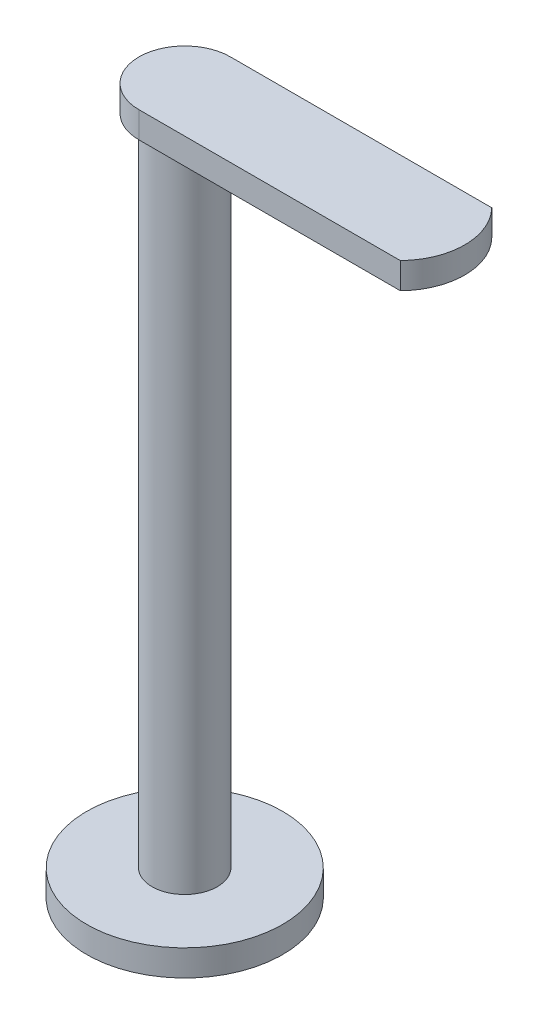
ISO-10303-21;
HEADER;
FILE_DESCRIPTION(('STEP AP214'),'2;1');
FILE_NAME('part.step','',(''),(''),'','','');
FILE_SCHEMA(('AUTOMOTIVE_DESIGN { 1 0 10303 214 1 1 1 1 }'));
ENDSEC;
DATA;
#1=APPLICATION_CONTEXT('core data for automotive mechanical design processes');
#2=APPLICATION_PROTOCOL_DEFINITION('international standard','automotive_design',2000,#1);
#3=PRODUCT_CONTEXT('',#1,'mechanical');
#4=PRODUCT('Part','Part','',(#3));
#5=PRODUCT_RELATED_PRODUCT_CATEGORY('part','',(#4));
#6=PRODUCT_DEFINITION_FORMATION('','',#4);
#7=PRODUCT_DEFINITION_CONTEXT('part definition',#1,'design');
#8=PRODUCT_DEFINITION('design','',#6,#7);
#9=PRODUCT_DEFINITION_SHAPE('','',#8);
#10=(LENGTH_UNIT() NAMED_UNIT(*) SI_UNIT(.MILLI.,.METRE.));
#11=(NAMED_UNIT(*) PLANE_ANGLE_UNIT() SI_UNIT($,.RADIAN.));
#12=(NAMED_UNIT(*) SI_UNIT($,.STERADIAN.) SOLID_ANGLE_UNIT());
#13=UNCERTAINTY_MEASURE_WITH_UNIT(LENGTH_MEASURE(1.E-05),#10,'distance_accuracy_value','');
#14=(GEOMETRIC_REPRESENTATION_CONTEXT(3) GLOBAL_UNCERTAINTY_ASSIGNED_CONTEXT((#13)) GLOBAL_UNIT_ASSIGNED_CONTEXT((#10,
#11,#12)) REPRESENTATION_CONTEXT('',''));
#15=CARTESIAN_POINT('',(0.,0.,0.));
#16=DIRECTION('',(0.,0.,1.));
#17=DIRECTION('',(1.,0.,0.));
#18=AXIS2_PLACEMENT_3D('',#15,#16,#17);
#19=CARTESIAN_POINT('',(0.,127.,0.));
#20=DIRECTION('',(0.,-1.,0.));
#21=DIRECTION('',(0.,0.,-1.));
#22=AXIS2_PLACEMENT_3D('',#19,#20,#21);
#23=CYLINDRICAL_SURFACE('',#22,6.35);
#24=CARTESIAN_POINT('',(0.,127.,0.));
#25=DIRECTION('',(0.,1.,0.));
#26=DIRECTION('',(0.,0.,1.));
#27=AXIS2_PLACEMENT_3D('',#24,#25,#26);
#28=CIRCLE('',#27,6.35);
#29=CARTESIAN_POINT('',(0.,127.,6.35));
#30=VERTEX_POINT('',#29);
#31=EDGE_CURVE('E11',#30,#30,#28,.T.);
#32=ORIENTED_EDGE('',*,*,#31,.F.);
#33=EDGE_LOOP('',(#32));
#34=FACE_BOUND('',#33,.T.);
#35=CARTESIAN_POINT('',(0.,0.,0.));
#36=DIRECTION('',(0.,-1.,0.));
#37=DIRECTION('',(0.,0.,-1.));
#38=AXIS2_PLACEMENT_3D('',#35,#36,#37);
#39=CIRCLE('',#38,6.35);
#40=CARTESIAN_POINT('',(0.,0.,-6.35));
#41=VERTEX_POINT('',#40);
#42=EDGE_CURVE('E98',#41,#41,#39,.T.);
#43=ORIENTED_EDGE('',*,*,#42,.F.);
#44=EDGE_LOOP('',(#43));
#45=FACE_BOUND('',#44,.T.);
#46=ADVANCED_FACE('F33',(#34,#45),#23,.T.);
#47=CARTESIAN_POINT('',(0.,132.08,0.));
#48=DIRECTION('',(0.,-1.,0.));
#49=DIRECTION('',(0.,0.,-1.));
#50=AXIS2_PLACEMENT_3D('',#47,#48,#49);
#51=CYLINDRICAL_SURFACE('',#50,8.89);
#52=CARTESIAN_POINT('',(0.,132.08,0.));
#53=DIRECTION('',(0.,1.,0.));
#54=DIRECTION('',(0.,0.,1.));
#55=AXIS2_PLACEMENT_3D('',#52,#53,#54);
#56=CIRCLE('',#55,8.89);
#57=CARTESIAN_POINT('',(0.,132.08,-8.89));
#58=VERTEX_POINT('',#57);
#59=CARTESIAN_POINT('',(0.,132.08,8.89));
#60=VERTEX_POINT('',#59);
#61=EDGE_CURVE('E40',#58,#60,#56,.T.);
#62=ORIENTED_EDGE('',*,*,#61,.F.);
#63=DIRECTION('',(0.,1.,0.));
#64=VECTOR('',#63,1.);
#65=CARTESIAN_POINT('',(0.,127.,-8.89));
#66=LINE('',#65,#64);
#67=CARTESIAN_POINT('',(0.,127.,-8.89));
#68=VERTEX_POINT('',#67);
#69=EDGE_CURVE('E105',#68,#58,#66,.T.);
#70=ORIENTED_EDGE('',*,*,#69,.F.);
#71=CARTESIAN_POINT('',(0.,127.,0.));
#72=DIRECTION('',(0.,1.,0.));
#73=DIRECTION('',(0.,0.,1.));
#74=AXIS2_PLACEMENT_3D('',#71,#72,#73);
#75=CIRCLE('',#74,8.89);
#76=CARTESIAN_POINT('',(0.,127.,8.89));
#77=VERTEX_POINT('',#76);
#78=EDGE_CURVE('E107',#68,#77,#75,.T.);
#79=ORIENTED_EDGE('',*,*,#78,.T.);
#80=DIRECTION('',(0.,1.,0.));
#81=VECTOR('',#80,1.);
#82=CARTESIAN_POINT('',(0.,127.,8.89));
#83=LINE('',#82,#81);
#84=EDGE_CURVE('E78',#77,#60,#83,.T.);
#85=ORIENTED_EDGE('',*,*,#84,.T.);
#86=EDGE_LOOP('',(#62,#70,#79,#85));
#87=FACE_BOUND('',#86,.T.);
#88=ADVANCED_FACE('F112',(#87),#51,.T.);
#89=CARTESIAN_POINT('',(0.,132.08,0.));
#90=DIRECTION('',(0.,1.,0.));
#91=DIRECTION('',(0.,0.,1.));
#92=AXIS2_PLACEMENT_3D('',#89,#90,#91);
#93=PLANE('',#92);
#94=ORIENTED_EDGE('',*,*,#61,.T.);
#95=DIRECTION('',(1.,0.,0.));
#96=VECTOR('',#95,1.);
#97=CARTESIAN_POINT('',(0.,132.08,8.89));
#98=LINE('',#97,#96);
#99=CARTESIAN_POINT('',(50.8,132.08,8.89));
#100=VERTEX_POINT('',#99);
#101=EDGE_CURVE('E102',#60,#100,#98,.T.);
#102=ORIENTED_EDGE('',*,*,#101,.T.);
#103=CARTESIAN_POINT('',(41.7303858957506,132.08,0.));
#104=DIRECTION('',(0.,1.,0.));
#105=DIRECTION('',(0.,0.,-1.));
#106=AXIS2_PLACEMENT_3D('',#103,#104,#105);
#107=CIRCLE('',#106,12.7);
#108=CARTESIAN_POINT('',(50.8,132.08,-8.89));
#109=VERTEX_POINT('',#108);
#110=EDGE_CURVE('E85',#100,#109,#107,.T.);
#111=ORIENTED_EDGE('',*,*,#110,.T.);
#112=DIRECTION('',(-1.,0.,0.));
#113=VECTOR('',#112,1.);
#114=CARTESIAN_POINT('',(0.,132.08,-8.89));
#115=LINE('',#114,#113);
#116=EDGE_CURVE('E47',#109,#58,#115,.T.);
#117=ORIENTED_EDGE('',*,*,#116,.T.);
#118=EDGE_LOOP('',(#94,#102,#111,#117));
#119=FACE_BOUND('',#118,.T.);
#120=ADVANCED_FACE('F121',(#119),#93,.T.);
#121=CARTESIAN_POINT('',(0.,127.,0.));
#122=DIRECTION('',(0.,1.,0.));
#123=DIRECTION('',(0.,0.,1.));
#124=AXIS2_PLACEMENT_3D('',#121,#122,#123);
#125=PLANE('',#124);
#126=ORIENTED_EDGE('',*,*,#31,.T.);
#127=EDGE_LOOP('',(#126));
#128=FACE_BOUND('',#127,.T.);
#129=ORIENTED_EDGE('',*,*,#78,.F.);
#130=DIRECTION('',(-1.,0.,0.));
#131=VECTOR('',#130,1.);
#132=CARTESIAN_POINT('',(0.,127.,-8.89));
#133=LINE('',#132,#131);
#134=CARTESIAN_POINT('',(50.8,127.,-8.89));
#135=VERTEX_POINT('',#134);
#136=EDGE_CURVE('E55',#135,#68,#133,.T.);
#137=ORIENTED_EDGE('',*,*,#136,.F.);
#138=CARTESIAN_POINT('',(41.7303858957506,127.,0.));
#139=DIRECTION('',(0.,1.,0.));
#140=DIRECTION('',(0.,0.,-1.));
#141=AXIS2_PLACEMENT_3D('',#138,#139,#140);
#142=CIRCLE('',#141,12.7);
#143=CARTESIAN_POINT('',(50.8,127.,8.89));
#144=VERTEX_POINT('',#143);
#145=EDGE_CURVE('E84',#144,#135,#142,.T.);
#146=ORIENTED_EDGE('',*,*,#145,.F.);
#147=DIRECTION('',(1.,0.,0.));
#148=VECTOR('',#147,1.);
#149=CARTESIAN_POINT('',(0.,127.,8.89));
#150=LINE('',#149,#148);
#151=EDGE_CURVE('E91',#77,#144,#150,.T.);
#152=ORIENTED_EDGE('',*,*,#151,.F.);
#153=EDGE_LOOP('',(#129,#137,#146,#152));
#154=FACE_BOUND('',#153,.T.);
#155=ADVANCED_FACE('F90',(#128,#154),#125,.F.);
#156=CARTESIAN_POINT('',(0.,127.,-8.89));
#157=DIRECTION('',(0.,0.,-1.));
#158=DIRECTION('',(-1.,0.,0.));
#159=AXIS2_PLACEMENT_3D('',#156,#157,#158);
#160=PLANE('',#159);
#161=ORIENTED_EDGE('',*,*,#116,.F.);
#162=DIRECTION('',(0.,1.,0.));
#163=VECTOR('',#162,1.);
#164=CARTESIAN_POINT('',(50.8,127.,-8.89));
#165=LINE('',#164,#163);
#166=EDGE_CURVE('E72',#135,#109,#165,.T.);
#167=ORIENTED_EDGE('',*,*,#166,.F.);
#168=ORIENTED_EDGE('',*,*,#136,.T.);
#169=ORIENTED_EDGE('',*,*,#69,.T.);
#170=EDGE_LOOP('',(#161,#167,#168,#169));
#171=FACE_BOUND('',#170,.T.);
#172=ADVANCED_FACE('F113',(#171),#160,.T.);
#173=CARTESIAN_POINT('',(41.7303858957506,127.,0.));
#174=DIRECTION('',(0.,1.,0.));
#175=DIRECTION('',(0.,0.,1.));
#176=AXIS2_PLACEMENT_3D('',#173,#174,#175);
#177=CYLINDRICAL_SURFACE('',#176,12.7);
#178=ORIENTED_EDGE('',*,*,#110,.F.);
#179=DIRECTION('',(0.,1.,0.));
#180=VECTOR('',#179,1.);
#181=CARTESIAN_POINT('',(50.8,127.,8.89));
#182=LINE('',#181,#180);
#183=EDGE_CURVE('E81',#144,#100,#182,.T.);
#184=ORIENTED_EDGE('',*,*,#183,.F.);
#185=ORIENTED_EDGE('',*,*,#145,.T.);
#186=ORIENTED_EDGE('',*,*,#166,.T.);
#187=EDGE_LOOP('',(#178,#184,#185,#186));
#188=FACE_BOUND('',#187,.T.);
#189=ADVANCED_FACE('F83',(#188),#177,.T.);
#190=CARTESIAN_POINT('',(0.,127.,8.89));
#191=DIRECTION('',(0.,0.,1.));
#192=DIRECTION('',(1.,0.,0.));
#193=AXIS2_PLACEMENT_3D('',#190,#191,#192);
#194=PLANE('',#193);
#195=ORIENTED_EDGE('',*,*,#101,.F.);
#196=ORIENTED_EDGE('',*,*,#84,.F.);
#197=ORIENTED_EDGE('',*,*,#151,.T.);
#198=ORIENTED_EDGE('',*,*,#183,.T.);
#199=EDGE_LOOP('',(#195,#196,#197,#198));
#200=FACE_BOUND('',#199,.T.);
#201=ADVANCED_FACE('F94',(#200),#194,.T.);
#202=CARTESIAN_POINT('',(0.,-5.08,0.));
#203=DIRECTION('',(0.,1.,0.));
#204=DIRECTION('',(0.,0.,1.));
#205=AXIS2_PLACEMENT_3D('',#202,#203,#204);
#206=CYLINDRICAL_SURFACE('',#205,19.05);
#207=CARTESIAN_POINT('',(0.,-5.08,0.));
#208=DIRECTION('',(0.,-1.,0.));
#209=DIRECTION('',(0.,0.,-1.));
#210=AXIS2_PLACEMENT_3D('',#207,#208,#209);
#211=CIRCLE('',#210,19.05);
#212=CARTESIAN_POINT('',(0.,-5.08,-19.05));
#213=VERTEX_POINT('',#212);
#214=EDGE_CURVE('E135',#213,#213,#211,.T.);
#215=ORIENTED_EDGE('',*,*,#214,.F.);
#216=EDGE_LOOP('',(#215));
#217=FACE_BOUND('',#216,.T.);
#218=CARTESIAN_POINT('',(0.,0.,0.));
#219=DIRECTION('',(0.,-1.,0.));
#220=DIRECTION('',(0.,0.,-1.));
#221=AXIS2_PLACEMENT_3D('',#218,#219,#220);
#222=CIRCLE('',#221,19.05);
#223=CARTESIAN_POINT('',(0.,0.,-19.05));
#224=VERTEX_POINT('',#223);
#225=EDGE_CURVE('E137',#224,#224,#222,.T.);
#226=ORIENTED_EDGE('',*,*,#225,.T.);
#227=EDGE_LOOP('',(#226));
#228=FACE_BOUND('',#227,.T.);
#229=ADVANCED_FACE('F144',(#217,#228),#206,.T.);
#230=CARTESIAN_POINT('',(0.,-5.08,0.));
#231=DIRECTION('',(0.,-1.,0.));
#232=DIRECTION('',(0.,0.,-1.));
#233=AXIS2_PLACEMENT_3D('',#230,#231,#232);
#234=PLANE('',#233);
#235=ORIENTED_EDGE('',*,*,#214,.T.);
#236=EDGE_LOOP('',(#235));
#237=FACE_BOUND('',#236,.T.);
#238=ADVANCED_FACE('F148',(#237),#234,.T.);
#239=CARTESIAN_POINT('',(0.,0.,0.));
#240=DIRECTION('',(0.,-1.,0.));
#241=DIRECTION('',(0.,0.,-1.));
#242=AXIS2_PLACEMENT_3D('',#239,#240,#241);
#243=PLANE('',#242);
#244=ORIENTED_EDGE('',*,*,#42,.T.);
#245=EDGE_LOOP('',(#244));
#246=FACE_BOUND('',#245,.T.);
#247=ORIENTED_EDGE('',*,*,#225,.F.);
#248=EDGE_LOOP('',(#247));
#249=FACE_BOUND('',#248,.T.);
#250=ADVANCED_FACE('F146',(#246,#249),#243,.F.);
#251=CLOSED_SHELL('',(#46,#88,#120,#155,#172,#189,#201,#229,#238,#250));
#252=MANIFOLD_SOLID_BREP('B2',#251);
#253=ADVANCED_BREP_SHAPE_REPRESENTATION('',(#18,#252),#14);
#254=SHAPE_DEFINITION_REPRESENTATION(#9,#253);
ENDSEC;
END-ISO-10303-21;
